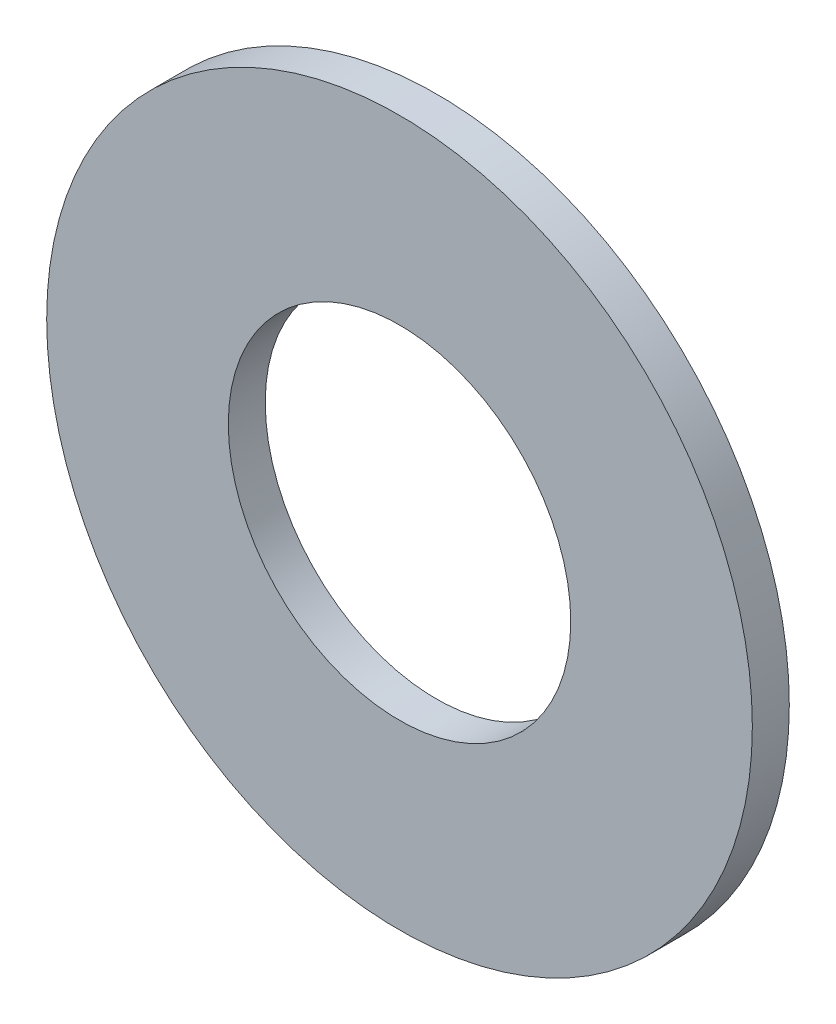
ISO-10303-21;
HEADER;
FILE_DESCRIPTION(('STEP AP214'),'2;1');
FILE_NAME('part.step','',(''),(''),'','','');
FILE_SCHEMA(('AUTOMOTIVE_DESIGN { 1 0 10303 214 1 1 1 1 }'));
ENDSEC;
DATA;
#1=APPLICATION_CONTEXT('core data for automotive mechanical design processes');
#2=APPLICATION_PROTOCOL_DEFINITION('international standard','automotive_design',2000,#1);
#3=PRODUCT_CONTEXT('',#1,'mechanical');
#4=PRODUCT('Part','Part','',(#3));
#5=PRODUCT_RELATED_PRODUCT_CATEGORY('part','',(#4));
#6=PRODUCT_DEFINITION_FORMATION('','',#4);
#7=PRODUCT_DEFINITION_CONTEXT('part definition',#1,'design');
#8=PRODUCT_DEFINITION('design','',#6,#7);
#9=PRODUCT_DEFINITION_SHAPE('','',#8);
#10=(LENGTH_UNIT() NAMED_UNIT(*) SI_UNIT(.MILLI.,.METRE.));
#11=(NAMED_UNIT(*) PLANE_ANGLE_UNIT() SI_UNIT($,.RADIAN.));
#12=(NAMED_UNIT(*) SI_UNIT($,.STERADIAN.) SOLID_ANGLE_UNIT());
#13=UNCERTAINTY_MEASURE_WITH_UNIT(LENGTH_MEASURE(1.E-05),#10,'distance_accuracy_value','');
#14=(GEOMETRIC_REPRESENTATION_CONTEXT(3) GLOBAL_UNCERTAINTY_ASSIGNED_CONTEXT((#13)) GLOBAL_UNIT_ASSIGNED_CONTEXT((#10,
#11,#12)) REPRESENTATION_CONTEXT('',''));
#15=CARTESIAN_POINT('',(0.,0.,0.));
#16=DIRECTION('',(0.,0.,1.));
#17=DIRECTION('',(1.,0.,0.));
#18=AXIS2_PLACEMENT_3D('',#15,#16,#17);
#19=CARTESIAN_POINT('',(0.,0.,3.562));
#20=DIRECTION('',(0.,0.,1.));
#21=DIRECTION('',(1.,0.,0.));
#22=AXIS2_PLACEMENT_3D('',#19,#20,#21);
#23=PLANE('',#22);
#24=CARTESIAN_POINT('',(0.,0.,3.562));
#25=DIRECTION('',(0.,0.,1.));
#26=DIRECTION('',(1.,0.,0.));
#27=AXIS2_PLACEMENT_3D('',#24,#25,#26);
#28=CIRCLE('',#27,34.);
#29=CARTESIAN_POINT('',(34.,0.,3.562));
#30=VERTEX_POINT('',#29);
#31=EDGE_CURVE('E10',#30,#30,#28,.T.);
#32=ORIENTED_EDGE('',*,*,#31,.T.);
#33=EDGE_LOOP('',(#32));
#34=FACE_BOUND('',#33,.T.);
#35=CARTESIAN_POINT('',(0.,0.,3.562));
#36=DIRECTION('',(0.,0.,1.));
#37=DIRECTION('',(1.,0.,0.));
#38=AXIS2_PLACEMENT_3D('',#35,#36,#37);
#39=CIRCLE('',#38,16.5);
#40=CARTESIAN_POINT('',(16.5,0.,3.562));
#41=VERTEX_POINT('',#40);
#42=EDGE_CURVE('E52',#41,#41,#39,.T.);
#43=ORIENTED_EDGE('',*,*,#42,.F.);
#44=EDGE_LOOP('',(#43));
#45=FACE_BOUND('',#44,.T.);
#46=ADVANCED_FACE('F39',(#34,#45),#23,.T.);
#47=CARTESIAN_POINT('',(0.,0.,0.));
#48=DIRECTION('',(0.,0.,1.));
#49=DIRECTION('',(1.,0.,0.));
#50=AXIS2_PLACEMENT_3D('',#47,#48,#49);
#51=PLANE('',#50);
#52=CARTESIAN_POINT('',(0.,0.,0.));
#53=DIRECTION('',(0.,0.,1.));
#54=DIRECTION('',(1.,0.,0.));
#55=AXIS2_PLACEMENT_3D('',#52,#53,#54);
#56=CIRCLE('',#55,34.);
#57=CARTESIAN_POINT('',(34.,0.,0.));
#58=VERTEX_POINT('',#57);
#59=EDGE_CURVE('E43',#58,#58,#56,.T.);
#60=ORIENTED_EDGE('',*,*,#59,.F.);
#61=EDGE_LOOP('',(#60));
#62=FACE_BOUND('',#61,.T.);
#63=CARTESIAN_POINT('',(0.,0.,0.));
#64=DIRECTION('',(0.,0.,1.));
#65=DIRECTION('',(1.,0.,0.));
#66=AXIS2_PLACEMENT_3D('',#63,#64,#65);
#67=CIRCLE('',#66,16.5);
#68=CARTESIAN_POINT('',(16.5,0.,0.));
#69=VERTEX_POINT('',#68);
#70=EDGE_CURVE('E54',#69,#69,#67,.T.);
#71=ORIENTED_EDGE('',*,*,#70,.T.);
#72=EDGE_LOOP('',(#71));
#73=FACE_BOUND('',#72,.T.);
#74=ADVANCED_FACE('F66',(#62,#73),#51,.F.);
#75=CARTESIAN_POINT('',(0.,0.,3.562));
#76=DIRECTION('',(0.,0.,-1.));
#77=DIRECTION('',(-1.,0.,0.));
#78=AXIS2_PLACEMENT_3D('',#75,#76,#77);
#79=CYLINDRICAL_SURFACE('',#78,34.);
#80=ORIENTED_EDGE('',*,*,#31,.F.);
#81=EDGE_LOOP('',(#80));
#82=FACE_BOUND('',#81,.T.);
#83=ORIENTED_EDGE('',*,*,#59,.T.);
#84=EDGE_LOOP('',(#83));
#85=FACE_BOUND('',#84,.T.);
#86=ADVANCED_FACE('F41',(#82,#85),#79,.T.);
#87=CARTESIAN_POINT('',(0.,0.,3.562));
#88=DIRECTION('',(0.,0.,-1.));
#89=DIRECTION('',(-1.,0.,0.));
#90=AXIS2_PLACEMENT_3D('',#87,#88,#89);
#91=CYLINDRICAL_SURFACE('',#90,16.5);
#92=ORIENTED_EDGE('',*,*,#42,.T.);
#93=EDGE_LOOP('',(#92));
#94=FACE_BOUND('',#93,.T.);
#95=ORIENTED_EDGE('',*,*,#70,.F.);
#96=EDGE_LOOP('',(#95));
#97=FACE_BOUND('',#96,.T.);
#98=ADVANCED_FACE('F62',(#94,#97),#91,.F.);
#99=CLOSED_SHELL('',(#46,#74,#86,#98));
#100=MANIFOLD_SOLID_BREP('B2',#99);
#101=ADVANCED_BREP_SHAPE_REPRESENTATION('',(#18,#100),#14);
#102=SHAPE_DEFINITION_REPRESENTATION(#9,#101);
ENDSEC;
END-ISO-10303-21;
